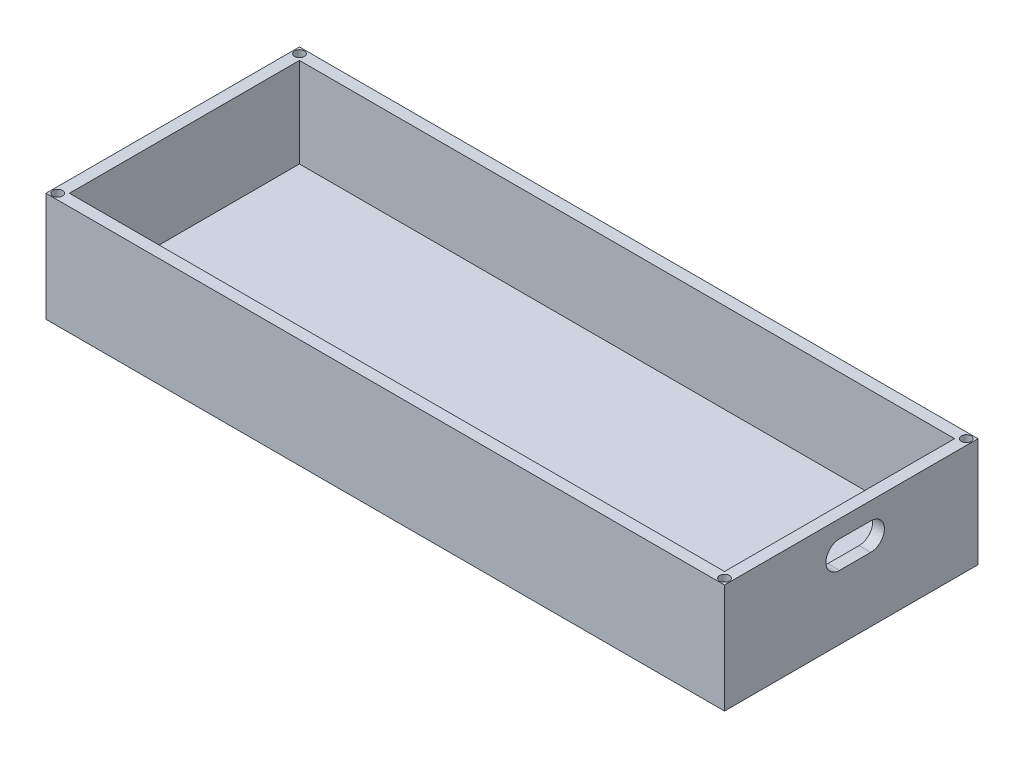
ISO-10303-21;
HEADER;
FILE_DESCRIPTION(('STEP AP214'),'2;1');
FILE_NAME('part.step','',(''),(''),'','','');
FILE_SCHEMA(('AUTOMOTIVE_DESIGN { 1 0 10303 214 1 1 1 1 }'));
ENDSEC;
DATA;
#1=APPLICATION_CONTEXT('core data for automotive mechanical design processes');
#2=APPLICATION_PROTOCOL_DEFINITION('international standard','automotive_design',2000,#1);
#3=PRODUCT_CONTEXT('',#1,'mechanical');
#4=PRODUCT('Part','Part','',(#3));
#5=PRODUCT_RELATED_PRODUCT_CATEGORY('part','',(#4));
#6=PRODUCT_DEFINITION_FORMATION('','',#4);
#7=PRODUCT_DEFINITION_CONTEXT('part definition',#1,'design');
#8=PRODUCT_DEFINITION('design','',#6,#7);
#9=PRODUCT_DEFINITION_SHAPE('','',#8);
#10=(LENGTH_UNIT() NAMED_UNIT(*) SI_UNIT(.MILLI.,.METRE.));
#11=(NAMED_UNIT(*) PLANE_ANGLE_UNIT() SI_UNIT($,.RADIAN.));
#12=(NAMED_UNIT(*) SI_UNIT($,.STERADIAN.) SOLID_ANGLE_UNIT());
#13=UNCERTAINTY_MEASURE_WITH_UNIT(LENGTH_MEASURE(1.E-05),#10,'distance_accuracy_value','');
#14=(GEOMETRIC_REPRESENTATION_CONTEXT(3) GLOBAL_UNCERTAINTY_ASSIGNED_CONTEXT((#13)) GLOBAL_UNIT_ASSIGNED_CONTEXT((#10,
#11,#12)) REPRESENTATION_CONTEXT('',''));
#15=CARTESIAN_POINT('',(0.,0.,0.));
#16=DIRECTION('',(0.,0.,1.));
#17=DIRECTION('',(1.,0.,0.));
#18=AXIS2_PLACEMENT_3D('',#15,#16,#17);
#19=CARTESIAN_POINT('',(87.,5.,32.5));
#20=DIRECTION('',(-1.,0.,0.));
#21=DIRECTION('',(0.,0.,1.));
#22=AXIS2_PLACEMENT_3D('',#19,#20,#21);
#23=PLANE('',#22);
#24=DIRECTION('',(0.,0.,-1.));
#25=VECTOR('',#24,1.);
#26=CARTESIAN_POINT('',(87.,16.5,3.00000000000001));
#27=LINE('',#26,#25);
#28=CARTESIAN_POINT('',(87.,16.5,3.00000000000001));
#29=VERTEX_POINT('',#28);
#30=CARTESIAN_POINT('',(87.,16.5,-4.99999999999999));
#31=VERTEX_POINT('',#30);
#32=EDGE_CURVE('E140',#29,#31,#27,.T.);
#33=ORIENTED_EDGE('',*,*,#32,.F.);
#34=CARTESIAN_POINT('',(87.,20.,3.00000000000001));
#35=DIRECTION('',(1.,0.,0.));
#36=DIRECTION('',(0.,0.,-1.));
#37=AXIS2_PLACEMENT_3D('',#34,#35,#36);
#38=CIRCLE('',#37,3.5);
#39=CARTESIAN_POINT('',(87.,23.5,3.00000000000001));
#40=VERTEX_POINT('',#39);
#41=EDGE_CURVE('E54',#40,#29,#38,.T.);
#42=ORIENTED_EDGE('',*,*,#41,.F.);
#43=DIRECTION('',(0.,0.,1.));
#44=VECTOR('',#43,1.);
#45=CARTESIAN_POINT('',(87.,23.5,3.00000000000001));
#46=LINE('',#45,#44);
#47=CARTESIAN_POINT('',(87.,23.5,-4.99999999999999));
#48=VERTEX_POINT('',#47);
#49=EDGE_CURVE('E147',#48,#40,#46,.T.);
#50=ORIENTED_EDGE('',*,*,#49,.F.);
#51=CARTESIAN_POINT('',(87.,20.,-4.99999999999999));
#52=DIRECTION('',(1.,0.,0.));
#53=DIRECTION('',(0.,0.,-1.));
#54=AXIS2_PLACEMENT_3D('',#51,#52,#53);
#55=CIRCLE('',#54,3.5);
#56=EDGE_CURVE('E130',#31,#48,#55,.T.);
#57=ORIENTED_EDGE('',*,*,#56,.F.);
#58=EDGE_LOOP('',(#33,#42,#50,#57));
#59=FACE_BOUND('',#58,.T.);
#60=DIRECTION('',(0.,0.,-1.));
#61=VECTOR('',#60,1.);
#62=CARTESIAN_POINT('',(87.,0.,32.5));
#63=LINE('',#62,#61);
#64=CARTESIAN_POINT('',(87.,0.,32.5));
#65=VERTEX_POINT('',#64);
#66=CARTESIAN_POINT('',(87.,0.,-32.5));
#67=VERTEX_POINT('',#66);
#68=EDGE_CURVE('E219',#65,#67,#63,.T.);
#69=ORIENTED_EDGE('',*,*,#68,.T.);
#70=DIRECTION('',(0.,-1.,0.));
#71=VECTOR('',#70,1.);
#72=CARTESIAN_POINT('',(87.,5.,-32.5));
#73=LINE('',#72,#71);
#74=CARTESIAN_POINT('',(87.,28.,-32.5));
#75=VERTEX_POINT('',#74);
#76=EDGE_CURVE('E244',#75,#67,#73,.T.);
#77=ORIENTED_EDGE('',*,*,#76,.F.);
#78=DIRECTION('',(0.,0.,-1.));
#79=VECTOR('',#78,1.);
#80=CARTESIAN_POINT('',(87.,28.,32.5));
#81=LINE('',#80,#79);
#82=CARTESIAN_POINT('',(87.,28.,32.5));
#83=VERTEX_POINT('',#82);
#84=EDGE_CURVE('E211',#83,#75,#81,.T.);
#85=ORIENTED_EDGE('',*,*,#84,.F.);
#86=DIRECTION('',(0.,-1.,0.));
#87=VECTOR('',#86,1.);
#88=CARTESIAN_POINT('',(87.,5.,32.5));
#89=LINE('',#88,#87);
#90=EDGE_CURVE('E232',#83,#65,#89,.T.);
#91=ORIENTED_EDGE('',*,*,#90,.T.);
#92=EDGE_LOOP('',(#69,#77,#85,#91));
#93=FACE_BOUND('',#92,.T.);
#94=ADVANCED_FACE('F39',(#59,#93),#23,.F.);
#95=CARTESIAN_POINT('',(-87.,5.,-32.5));
#96=DIRECTION('',(0.,0.,1.));
#97=DIRECTION('',(1.,0.,0.));
#98=AXIS2_PLACEMENT_3D('',#95,#96,#97);
#99=PLANE('',#98);
#100=DIRECTION('',(-1.,0.,0.));
#101=VECTOR('',#100,1.);
#102=CARTESIAN_POINT('',(-87.,0.,-32.5));
#103=LINE('',#102,#101);
#104=CARTESIAN_POINT('',(-87.,0.,-32.5));
#105=VERTEX_POINT('',#104);
#106=EDGE_CURVE('E223',#67,#105,#103,.T.);
#107=ORIENTED_EDGE('',*,*,#106,.T.);
#108=DIRECTION('',(0.,-1.,0.));
#109=VECTOR('',#108,1.);
#110=CARTESIAN_POINT('',(-87.,5.,-32.5));
#111=LINE('',#110,#109);
#112=CARTESIAN_POINT('',(-87.,28.,-32.5));
#113=VERTEX_POINT('',#112);
#114=EDGE_CURVE('E240',#113,#105,#111,.T.);
#115=ORIENTED_EDGE('',*,*,#114,.F.);
#116=DIRECTION('',(-1.,0.,0.));
#117=VECTOR('',#116,1.);
#118=CARTESIAN_POINT('',(-87.,28.,-32.5));
#119=LINE('',#118,#117);
#120=EDGE_CURVE('E215',#75,#113,#119,.T.);
#121=ORIENTED_EDGE('',*,*,#120,.F.);
#122=ORIENTED_EDGE('',*,*,#76,.T.);
#123=EDGE_LOOP('',(#107,#115,#121,#122));
#124=FACE_BOUND('',#123,.T.);
#125=ADVANCED_FACE('F343',(#124),#99,.F.);
#126=CARTESIAN_POINT('',(-87.,5.,32.5));
#127=DIRECTION('',(1.,0.,0.));
#128=DIRECTION('',(0.,0.,-1.));
#129=AXIS2_PLACEMENT_3D('',#126,#127,#128);
#130=PLANE('',#129);
#131=DIRECTION('',(0.,0.,1.));
#132=VECTOR('',#131,1.);
#133=CARTESIAN_POINT('',(-87.,0.,32.5));
#134=LINE('',#133,#132);
#135=CARTESIAN_POINT('',(-87.,0.,32.5));
#136=VERTEX_POINT('',#135);
#137=EDGE_CURVE('E226',#105,#136,#134,.T.);
#138=ORIENTED_EDGE('',*,*,#137,.T.);
#139=DIRECTION('',(0.,-1.,0.));
#140=VECTOR('',#139,1.);
#141=CARTESIAN_POINT('',(-87.,5.,32.5));
#142=LINE('',#141,#140);
#143=CARTESIAN_POINT('',(-87.,28.,32.5));
#144=VERTEX_POINT('',#143);
#145=EDGE_CURVE('E236',#144,#136,#142,.T.);
#146=ORIENTED_EDGE('',*,*,#145,.F.);
#147=DIRECTION('',(0.,0.,1.));
#148=VECTOR('',#147,1.);
#149=CARTESIAN_POINT('',(-87.,28.,32.5));
#150=LINE('',#149,#148);
#151=EDGE_CURVE('E203',#113,#144,#150,.T.);
#152=ORIENTED_EDGE('',*,*,#151,.F.);
#153=ORIENTED_EDGE('',*,*,#114,.T.);
#154=EDGE_LOOP('',(#138,#146,#152,#153));
#155=FACE_BOUND('',#154,.T.);
#156=ADVANCED_FACE('F347',(#155),#130,.F.);
#157=CARTESIAN_POINT('',(-87.,5.,32.5));
#158=DIRECTION('',(0.,0.,-1.));
#159=DIRECTION('',(-1.,0.,0.));
#160=AXIS2_PLACEMENT_3D('',#157,#158,#159);
#161=PLANE('',#160);
#162=DIRECTION('',(1.,0.,0.));
#163=VECTOR('',#162,1.);
#164=CARTESIAN_POINT('',(-87.,0.,32.5));
#165=LINE('',#164,#163);
#166=EDGE_CURVE('E229',#136,#65,#165,.T.);
#167=ORIENTED_EDGE('',*,*,#166,.T.);
#168=ORIENTED_EDGE('',*,*,#90,.F.);
#169=DIRECTION('',(1.,0.,0.));
#170=VECTOR('',#169,1.);
#171=CARTESIAN_POINT('',(-87.,28.,32.5));
#172=LINE('',#171,#170);
#173=EDGE_CURVE('E207',#144,#83,#172,.T.);
#174=ORIENTED_EDGE('',*,*,#173,.F.);
#175=ORIENTED_EDGE('',*,*,#145,.T.);
#176=EDGE_LOOP('',(#167,#168,#174,#175));
#177=FACE_BOUND('',#176,.T.);
#178=ADVANCED_FACE('F352',(#177),#161,.F.);
#179=CARTESIAN_POINT('',(0.,0.,0.));
#180=DIRECTION('',(0.,-1.,0.));
#181=DIRECTION('',(0.,0.,-1.));
#182=AXIS2_PLACEMENT_3D('',#179,#180,#181);
#183=PLANE('',#182);
#184=ORIENTED_EDGE('',*,*,#68,.F.);
#185=ORIENTED_EDGE('',*,*,#166,.F.);
#186=ORIENTED_EDGE('',*,*,#137,.F.);
#187=ORIENTED_EDGE('',*,*,#106,.F.);
#188=EDGE_LOOP('',(#184,#185,#186,#187));
#189=FACE_BOUND('',#188,.T.);
#190=ADVANCED_FACE('F310',(#189),#183,.T.);
#191=CARTESIAN_POINT('',(0.,28.,0.));
#192=DIRECTION('',(0.,-1.,0.));
#193=DIRECTION('',(0.,0.,-1.));
#194=AXIS2_PLACEMENT_3D('',#191,#192,#193);
#195=PLANE('',#194);
#196=CARTESIAN_POINT('',(-85.4999999999993,28.,31.));
#197=DIRECTION('',(0.,1.,0.));
#198=DIRECTION('',(0.,0.,1.));
#199=AXIS2_PLACEMENT_3D('',#196,#197,#198);
#200=CIRCLE('',#199,1.25);
#201=CARTESIAN_POINT('',(-85.4999999999993,28.,32.25));
#202=VERTEX_POINT('',#201);
#203=EDGE_CURVE('E273',#202,#202,#200,.T.);
#204=ORIENTED_EDGE('',*,*,#203,.F.);
#205=EDGE_LOOP('',(#204));
#206=FACE_BOUND('',#205,.T.);
#207=CARTESIAN_POINT('',(85.5000000000007,28.,31.));
#208=DIRECTION('',(0.,1.,0.));
#209=DIRECTION('',(0.,0.,1.));
#210=AXIS2_PLACEMENT_3D('',#207,#208,#209);
#211=CIRCLE('',#210,1.25);
#212=CARTESIAN_POINT('',(85.5000000000007,28.,32.25));
#213=VERTEX_POINT('',#212);
#214=EDGE_CURVE('E281',#213,#213,#211,.T.);
#215=ORIENTED_EDGE('',*,*,#214,.F.);
#216=EDGE_LOOP('',(#215));
#217=FACE_BOUND('',#216,.T.);
#218=CARTESIAN_POINT('',(85.5,28.,-31.));
#219=DIRECTION('',(0.,1.,0.));
#220=DIRECTION('',(0.,0.,1.));
#221=AXIS2_PLACEMENT_3D('',#218,#219,#220);
#222=CIRCLE('',#221,1.25);
#223=CARTESIAN_POINT('',(85.5,28.,-29.75));
#224=VERTEX_POINT('',#223);
#225=EDGE_CURVE('E289',#224,#224,#222,.T.);
#226=ORIENTED_EDGE('',*,*,#225,.F.);
#227=EDGE_LOOP('',(#226));
#228=FACE_BOUND('',#227,.T.);
#229=CARTESIAN_POINT('',(-85.5,28.,-31.));
#230=DIRECTION('',(0.,1.,0.));
#231=DIRECTION('',(0.,0.,1.));
#232=AXIS2_PLACEMENT_3D('',#229,#230,#231);
#233=CIRCLE('',#232,1.25);
#234=CARTESIAN_POINT('',(-85.5,28.,-29.75));
#235=VERTEX_POINT('',#234);
#236=EDGE_CURVE('E266',#235,#235,#233,.T.);
#237=ORIENTED_EDGE('',*,*,#236,.F.);
#238=EDGE_LOOP('',(#237));
#239=FACE_BOUND('',#238,.T.);
#240=ORIENTED_EDGE('',*,*,#151,.T.);
#241=ORIENTED_EDGE('',*,*,#173,.T.);
#242=ORIENTED_EDGE('',*,*,#84,.T.);
#243=ORIENTED_EDGE('',*,*,#120,.T.);
#244=EDGE_LOOP('',(#240,#241,#242,#243));
#245=FACE_BOUND('',#244,.T.);
#246=DIRECTION('',(1.,0.,0.));
#247=VECTOR('',#246,1.);
#248=CARTESIAN_POINT('',(-84.,28.,29.5));
#249=LINE('',#248,#247);
#250=CARTESIAN_POINT('',(-84.,28.,29.5));
#251=VERTEX_POINT('',#250);
#252=CARTESIAN_POINT('',(84.,28.,29.5));
#253=VERTEX_POINT('',#252);
#254=EDGE_CURVE('E162',#251,#253,#249,.T.);
#255=ORIENTED_EDGE('',*,*,#254,.F.);
#256=DIRECTION('',(0.,0.,1.));
#257=VECTOR('',#256,1.);
#258=CARTESIAN_POINT('',(-84.,28.,29.5));
#259=LINE('',#258,#257);
#260=CARTESIAN_POINT('',(-84.,28.,-29.5));
#261=VERTEX_POINT('',#260);
#262=EDGE_CURVE('E173',#261,#251,#259,.T.);
#263=ORIENTED_EDGE('',*,*,#262,.F.);
#264=DIRECTION('',(-1.,0.,0.));
#265=VECTOR('',#264,1.);
#266=CARTESIAN_POINT('',(-84.,28.,-29.5));
#267=LINE('',#266,#265);
#268=CARTESIAN_POINT('',(84.,28.,-29.5));
#269=VERTEX_POINT('',#268);
#270=EDGE_CURVE('E169',#269,#261,#267,.T.);
#271=ORIENTED_EDGE('',*,*,#270,.F.);
#272=DIRECTION('',(0.,0.,-1.));
#273=VECTOR('',#272,1.);
#274=CARTESIAN_POINT('',(84.,28.,29.5));
#275=LINE('',#274,#273);
#276=EDGE_CURVE('E165',#253,#269,#275,.T.);
#277=ORIENTED_EDGE('',*,*,#276,.F.);
#278=EDGE_LOOP('',(#255,#263,#271,#277));
#279=FACE_BOUND('',#278,.T.);
#280=ADVANCED_FACE('F306',(#206,#217,#228,#239,#245,#279),#195,.F.);
#281=CARTESIAN_POINT('',(-84.,28.,29.5));
#282=DIRECTION('',(0.,0.,-1.));
#283=DIRECTION('',(-1.,0.,0.));
#284=AXIS2_PLACEMENT_3D('',#281,#282,#283);
#285=PLANE('',#284);
#286=DIRECTION('',(1.,0.,0.));
#287=VECTOR('',#286,1.);
#288=CARTESIAN_POINT('',(-84.,5.,29.5));
#289=LINE('',#288,#287);
#290=CARTESIAN_POINT('',(-84.,5.,29.5));
#291=VERTEX_POINT('',#290);
#292=CARTESIAN_POINT('',(84.,5.,29.5));
#293=VERTEX_POINT('',#292);
#294=EDGE_CURVE('E157',#291,#293,#289,.T.);
#295=ORIENTED_EDGE('',*,*,#294,.F.);
#296=DIRECTION('',(0.,-1.,0.));
#297=VECTOR('',#296,1.);
#298=CARTESIAN_POINT('',(-84.,28.,29.5));
#299=LINE('',#298,#297);
#300=EDGE_CURVE('E176',#251,#291,#299,.T.);
#301=ORIENTED_EDGE('',*,*,#300,.F.);
#302=ORIENTED_EDGE('',*,*,#254,.T.);
#303=DIRECTION('',(0.,-1.,0.));
#304=VECTOR('',#303,1.);
#305=CARTESIAN_POINT('',(84.,28.,29.5));
#306=LINE('',#305,#304);
#307=EDGE_CURVE('E199',#253,#293,#306,.T.);
#308=ORIENTED_EDGE('',*,*,#307,.T.);
#309=EDGE_LOOP('',(#295,#301,#302,#308));
#310=FACE_BOUND('',#309,.T.);
#311=ADVANCED_FACE('F309',(#310),#285,.T.);
#312=CARTESIAN_POINT('',(84.,28.,29.5));
#313=DIRECTION('',(-1.,0.,0.));
#314=DIRECTION('',(0.,0.,1.));
#315=AXIS2_PLACEMENT_3D('',#312,#313,#314);
#316=PLANE('',#315);
#317=CARTESIAN_POINT('',(84.,20.,3.00000000000001));
#318=DIRECTION('',(-1.,0.,0.));
#319=DIRECTION('',(0.,0.,1.));
#320=AXIS2_PLACEMENT_3D('',#317,#318,#319);
#321=CIRCLE('',#320,3.5);
#322=CARTESIAN_POINT('',(84.,16.5,3.00000000000001));
#323=VERTEX_POINT('',#322);
#324=CARTESIAN_POINT('',(84.,23.5,3.00000000000001));
#325=VERTEX_POINT('',#324);
#326=EDGE_CURVE('E11',#323,#325,#321,.T.);
#327=ORIENTED_EDGE('',*,*,#326,.F.);
#328=DIRECTION('',(0.,0.,1.));
#329=VECTOR('',#328,1.);
#330=CARTESIAN_POINT('',(84.,16.5,29.5));
#331=LINE('',#330,#329);
#332=CARTESIAN_POINT('',(84.,16.5,-4.99999999999999));
#333=VERTEX_POINT('',#332);
#334=EDGE_CURVE('E248',#333,#323,#331,.T.);
#335=ORIENTED_EDGE('',*,*,#334,.F.);
#336=CARTESIAN_POINT('',(84.,20.,-4.99999999999999));
#337=DIRECTION('',(-1.,0.,0.));
#338=DIRECTION('',(0.,0.,1.));
#339=AXIS2_PLACEMENT_3D('',#336,#337,#338);
#340=CIRCLE('',#339,3.5);
#341=CARTESIAN_POINT('',(84.,23.5,-4.99999999999999));
#342=VERTEX_POINT('',#341);
#343=EDGE_CURVE('E133',#342,#333,#340,.T.);
#344=ORIENTED_EDGE('',*,*,#343,.F.);
#345=DIRECTION('',(0.,0.,-1.));
#346=VECTOR('',#345,1.);
#347=CARTESIAN_POINT('',(84.,23.5,29.5));
#348=LINE('',#347,#346);
#349=EDGE_CURVE('E47',#325,#342,#348,.T.);
#350=ORIENTED_EDGE('',*,*,#349,.F.);
#351=EDGE_LOOP('',(#327,#335,#344,#350));
#352=FACE_BOUND('',#351,.T.);
#353=DIRECTION('',(0.,0.,-1.));
#354=VECTOR('',#353,1.);
#355=CARTESIAN_POINT('',(84.,5.,29.5));
#356=LINE('',#355,#354);
#357=CARTESIAN_POINT('',(84.,5.,-29.5));
#358=VERTEX_POINT('',#357);
#359=EDGE_CURVE('E180',#293,#358,#356,.T.);
#360=ORIENTED_EDGE('',*,*,#359,.F.);
#361=ORIENTED_EDGE('',*,*,#307,.F.);
#362=ORIENTED_EDGE('',*,*,#276,.T.);
#363=DIRECTION('',(0.,-1.,0.));
#364=VECTOR('',#363,1.);
#365=CARTESIAN_POINT('',(84.,28.,-29.5));
#366=LINE('',#365,#364);
#367=EDGE_CURVE('E196',#269,#358,#366,.T.);
#368=ORIENTED_EDGE('',*,*,#367,.T.);
#369=EDGE_LOOP('',(#360,#361,#362,#368));
#370=FACE_BOUND('',#369,.T.);
#371=ADVANCED_FACE('F259',(#352,#370),#316,.T.);
#372=CARTESIAN_POINT('',(-84.,28.,-29.5));
#373=DIRECTION('',(0.,0.,1.));
#374=DIRECTION('',(1.,0.,0.));
#375=AXIS2_PLACEMENT_3D('',#372,#373,#374);
#376=PLANE('',#375);
#377=DIRECTION('',(-1.,0.,0.));
#378=VECTOR('',#377,1.);
#379=CARTESIAN_POINT('',(-84.,5.,-29.5));
#380=LINE('',#379,#378);
#381=CARTESIAN_POINT('',(-84.,5.,-29.5));
#382=VERTEX_POINT('',#381);
#383=EDGE_CURVE('E184',#358,#382,#380,.T.);
#384=ORIENTED_EDGE('',*,*,#383,.F.);
#385=ORIENTED_EDGE('',*,*,#367,.F.);
#386=ORIENTED_EDGE('',*,*,#270,.T.);
#387=DIRECTION('',(0.,-1.,0.));
#388=VECTOR('',#387,1.);
#389=CARTESIAN_POINT('',(-84.,28.,-29.5));
#390=LINE('',#389,#388);
#391=EDGE_CURVE('E193',#261,#382,#390,.T.);
#392=ORIENTED_EDGE('',*,*,#391,.T.);
#393=EDGE_LOOP('',(#384,#385,#386,#392));
#394=FACE_BOUND('',#393,.T.);
#395=ADVANCED_FACE('F333',(#394),#376,.T.);
#396=CARTESIAN_POINT('',(-84.,28.,29.5));
#397=DIRECTION('',(1.,0.,0.));
#398=DIRECTION('',(0.,0.,-1.));
#399=AXIS2_PLACEMENT_3D('',#396,#397,#398);
#400=PLANE('',#399);
#401=DIRECTION('',(0.,0.,1.));
#402=VECTOR('',#401,1.);
#403=CARTESIAN_POINT('',(-84.,5.,29.5));
#404=LINE('',#403,#402);
#405=EDGE_CURVE('E166',#382,#291,#404,.T.);
#406=ORIENTED_EDGE('',*,*,#405,.F.);
#407=ORIENTED_EDGE('',*,*,#391,.F.);
#408=ORIENTED_EDGE('',*,*,#262,.T.);
#409=ORIENTED_EDGE('',*,*,#300,.T.);
#410=EDGE_LOOP('',(#406,#407,#408,#409));
#411=FACE_BOUND('',#410,.T.);
#412=ADVANCED_FACE('F331',(#411),#400,.T.);
#413=CARTESIAN_POINT('',(0.,5.,0.));
#414=DIRECTION('',(0.,-1.,0.));
#415=DIRECTION('',(0.,0.,-1.));
#416=AXIS2_PLACEMENT_3D('',#413,#414,#415);
#417=PLANE('',#416);
#418=ORIENTED_EDGE('',*,*,#405,.T.);
#419=ORIENTED_EDGE('',*,*,#294,.T.);
#420=ORIENTED_EDGE('',*,*,#359,.T.);
#421=ORIENTED_EDGE('',*,*,#383,.T.);
#422=EDGE_LOOP('',(#418,#419,#420,#421));
#423=FACE_BOUND('',#422,.T.);
#424=ADVANCED_FACE('F328',(#423),#417,.F.);
#425=CARTESIAN_POINT('',(64.,20.,3.00000000000001));
#426=DIRECTION('',(1.,0.,0.));
#427=DIRECTION('',(0.,0.,-1.));
#428=AXIS2_PLACEMENT_3D('',#425,#426,#427);
#429=CYLINDRICAL_SURFACE('',#428,3.5);
#430=ORIENTED_EDGE('',*,*,#326,.T.);
#431=DIRECTION('',(1.,0.,0.));
#432=VECTOR('',#431,1.);
#433=CARTESIAN_POINT('',(64.,23.5,3.00000000000001));
#434=LINE('',#433,#432);
#435=EDGE_CURVE('E154',#325,#40,#434,.T.);
#436=ORIENTED_EDGE('',*,*,#435,.T.);
#437=ORIENTED_EDGE('',*,*,#41,.T.);
#438=DIRECTION('',(1.,0.,0.));
#439=VECTOR('',#438,1.);
#440=CARTESIAN_POINT('',(64.,16.5,3.00000000000001));
#441=LINE('',#440,#439);
#442=EDGE_CURVE('E137',#323,#29,#441,.T.);
#443=ORIENTED_EDGE('',*,*,#442,.F.);
#444=EDGE_LOOP('',(#430,#436,#437,#443));
#445=FACE_BOUND('',#444,.T.);
#446=ADVANCED_FACE('F261',(#445),#429,.F.);
#447=CARTESIAN_POINT('',(64.,23.5,3.00000000000001));
#448=DIRECTION('',(0.,1.,0.));
#449=DIRECTION('',(0.,0.,1.));
#450=AXIS2_PLACEMENT_3D('',#447,#448,#449);
#451=PLANE('',#450);
#452=ORIENTED_EDGE('',*,*,#349,.T.);
#453=DIRECTION('',(1.,0.,0.));
#454=VECTOR('',#453,1.);
#455=CARTESIAN_POINT('',(64.,23.5,-4.99999999999999));
#456=LINE('',#455,#454);
#457=EDGE_CURVE('E136',#342,#48,#456,.T.);
#458=ORIENTED_EDGE('',*,*,#457,.T.);
#459=ORIENTED_EDGE('',*,*,#49,.T.);
#460=ORIENTED_EDGE('',*,*,#435,.F.);
#461=EDGE_LOOP('',(#452,#458,#459,#460));
#462=FACE_BOUND('',#461,.T.);
#463=ADVANCED_FACE('F256',(#462),#451,.F.);
#464=CARTESIAN_POINT('',(64.,20.,-4.99999999999999));
#465=DIRECTION('',(1.,0.,0.));
#466=DIRECTION('',(0.,0.,-1.));
#467=AXIS2_PLACEMENT_3D('',#464,#465,#466);
#468=CYLINDRICAL_SURFACE('',#467,3.5);
#469=ORIENTED_EDGE('',*,*,#343,.T.);
#470=DIRECTION('',(1.,0.,0.));
#471=VECTOR('',#470,1.);
#472=CARTESIAN_POINT('',(64.,16.5,-4.99999999999999));
#473=LINE('',#472,#471);
#474=EDGE_CURVE('E62',#333,#31,#473,.T.);
#475=ORIENTED_EDGE('',*,*,#474,.T.);
#476=ORIENTED_EDGE('',*,*,#56,.T.);
#477=ORIENTED_EDGE('',*,*,#457,.F.);
#478=EDGE_LOOP('',(#469,#475,#476,#477));
#479=FACE_BOUND('',#478,.T.);
#480=ADVANCED_FACE('F127',(#479),#468,.F.);
#481=CARTESIAN_POINT('',(64.,16.5,3.00000000000001));
#482=DIRECTION('',(0.,-1.,0.));
#483=DIRECTION('',(0.,0.,-1.));
#484=AXIS2_PLACEMENT_3D('',#481,#482,#483);
#485=PLANE('',#484);
#486=ORIENTED_EDGE('',*,*,#334,.T.);
#487=ORIENTED_EDGE('',*,*,#442,.T.);
#488=ORIENTED_EDGE('',*,*,#32,.T.);
#489=ORIENTED_EDGE('',*,*,#474,.F.);
#490=EDGE_LOOP('',(#486,#487,#488,#489));
#491=FACE_BOUND('',#490,.T.);
#492=ADVANCED_FACE('F141',(#491),#485,.F.);
#493=CARTESIAN_POINT('',(-85.5,23.,-31.));
#494=DIRECTION('',(0.,1.,0.));
#495=DIRECTION('',(0.,0.,1.));
#496=AXIS2_PLACEMENT_3D('',#493,#494,#495);
#497=CYLINDRICAL_SURFACE('',#496,1.25);
#498=CARTESIAN_POINT('',(-85.5,23.,-31.));
#499=DIRECTION('',(0.,1.,0.));
#500=DIRECTION('',(0.,0.,1.));
#501=AXIS2_PLACEMENT_3D('',#498,#499,#500);
#502=CIRCLE('',#501,1.25);
#503=CARTESIAN_POINT('',(-85.5,23.,-29.75));
#504=VERTEX_POINT('',#503);
#505=EDGE_CURVE('E263',#504,#504,#502,.T.);
#506=ORIENTED_EDGE('',*,*,#505,.F.);
#507=EDGE_LOOP('',(#506));
#508=FACE_BOUND('',#507,.T.);
#509=ORIENTED_EDGE('',*,*,#236,.T.);
#510=EDGE_LOOP('',(#509));
#511=FACE_BOUND('',#510,.T.);
#512=ADVANCED_FACE('F411',(#508,#511),#497,.F.);
#513=CARTESIAN_POINT('',(-85.5,23.,-31.));
#514=DIRECTION('',(0.,1.,0.));
#515=DIRECTION('',(0.,0.,1.));
#516=AXIS2_PLACEMENT_3D('',#513,#514,#515);
#517=PLANE('',#516);
#518=ORIENTED_EDGE('',*,*,#505,.T.);
#519=EDGE_LOOP('',(#518));
#520=FACE_BOUND('',#519,.T.);
#521=ADVANCED_FACE('F302',(#520),#517,.T.);
#522=CARTESIAN_POINT('',(85.5,23.,-31.));
#523=DIRECTION('',(0.,1.,0.));
#524=DIRECTION('',(0.,0.,1.));
#525=AXIS2_PLACEMENT_3D('',#522,#523,#524);
#526=CYLINDRICAL_SURFACE('',#525,1.25);
#527=CARTESIAN_POINT('',(85.5,23.,-31.));
#528=DIRECTION('',(0.,1.,0.));
#529=DIRECTION('',(0.,0.,1.));
#530=AXIS2_PLACEMENT_3D('',#527,#528,#529);
#531=CIRCLE('',#530,1.25);
#532=CARTESIAN_POINT('',(85.5,23.,-29.75));
#533=VERTEX_POINT('',#532);
#534=EDGE_CURVE('E271',#533,#533,#531,.T.);
#535=ORIENTED_EDGE('',*,*,#534,.F.);
#536=EDGE_LOOP('',(#535));
#537=FACE_BOUND('',#536,.T.);
#538=ORIENTED_EDGE('',*,*,#225,.T.);
#539=EDGE_LOOP('',(#538));
#540=FACE_BOUND('',#539,.T.);
#541=ADVANCED_FACE('F299',(#537,#540),#526,.F.);
#542=CARTESIAN_POINT('',(85.5,23.,-31.));
#543=DIRECTION('',(0.,1.,0.));
#544=DIRECTION('',(0.,0.,1.));
#545=AXIS2_PLACEMENT_3D('',#542,#543,#544);
#546=PLANE('',#545);
#547=ORIENTED_EDGE('',*,*,#534,.T.);
#548=EDGE_LOOP('',(#547));
#549=FACE_BOUND('',#548,.T.);
#550=ADVANCED_FACE('F297',(#549),#546,.T.);
#551=CARTESIAN_POINT('',(85.5000000000007,23.,31.));
#552=DIRECTION('',(0.,1.,0.));
#553=DIRECTION('',(0.,0.,1.));
#554=AXIS2_PLACEMENT_3D('',#551,#552,#553);
#555=CYLINDRICAL_SURFACE('',#554,1.25);
#556=CARTESIAN_POINT('',(85.5000000000007,23.,31.));
#557=DIRECTION('',(0.,1.,0.));
#558=DIRECTION('',(0.,0.,1.));
#559=AXIS2_PLACEMENT_3D('',#556,#557,#558);
#560=CIRCLE('',#559,1.25);
#561=CARTESIAN_POINT('',(85.5000000000007,23.,32.25));
#562=VERTEX_POINT('',#561);
#563=EDGE_CURVE('E285',#562,#562,#560,.T.);
#564=ORIENTED_EDGE('',*,*,#563,.F.);
#565=EDGE_LOOP('',(#564));
#566=FACE_BOUND('',#565,.T.);
#567=ORIENTED_EDGE('',*,*,#214,.T.);
#568=EDGE_LOOP('',(#567));
#569=FACE_BOUND('',#568,.T.);
#570=ADVANCED_FACE('F450',(#566,#569),#555,.F.);
#571=CARTESIAN_POINT('',(85.5000000000007,23.,31.));
#572=DIRECTION('',(0.,1.,0.));
#573=DIRECTION('',(0.,0.,1.));
#574=AXIS2_PLACEMENT_3D('',#571,#572,#573);
#575=PLANE('',#574);
#576=ORIENTED_EDGE('',*,*,#563,.T.);
#577=EDGE_LOOP('',(#576));
#578=FACE_BOUND('',#577,.T.);
#579=ADVANCED_FACE('F459',(#578),#575,.T.);
#580=CARTESIAN_POINT('',(-85.4999999999993,23.,31.));
#581=DIRECTION('',(0.,1.,0.));
#582=DIRECTION('',(0.,0.,1.));
#583=AXIS2_PLACEMENT_3D('',#580,#581,#582);
#584=CYLINDRICAL_SURFACE('',#583,1.25);
#585=CARTESIAN_POINT('',(-85.4999999999993,23.,31.));
#586=DIRECTION('',(0.,1.,0.));
#587=DIRECTION('',(0.,0.,1.));
#588=AXIS2_PLACEMENT_3D('',#585,#586,#587);
#589=CIRCLE('',#588,1.25);
#590=CARTESIAN_POINT('',(-85.4999999999993,23.,32.25));
#591=VERTEX_POINT('',#590);
#592=EDGE_CURVE('E277',#591,#591,#589,.T.);
#593=ORIENTED_EDGE('',*,*,#592,.F.);
#594=EDGE_LOOP('',(#593));
#595=FACE_BOUND('',#594,.T.);
#596=ORIENTED_EDGE('',*,*,#203,.T.);
#597=EDGE_LOOP('',(#596));
#598=FACE_BOUND('',#597,.T.);
#599=ADVANCED_FACE('F469',(#595,#598),#584,.F.);
#600=CARTESIAN_POINT('',(-85.4999999999993,23.,31.));
#601=DIRECTION('',(0.,1.,0.));
#602=DIRECTION('',(0.,0.,1.));
#603=AXIS2_PLACEMENT_3D('',#600,#601,#602);
#604=PLANE('',#603);
#605=ORIENTED_EDGE('',*,*,#592,.T.);
#606=EDGE_LOOP('',(#605));
#607=FACE_BOUND('',#606,.T.);
#608=ADVANCED_FACE('F479',(#607),#604,.T.);
#609=CLOSED_SHELL('',(#94,#125,#156,#178,#190,#280,#311,#371,#395,#412,#424,#446,#463,#480,#492,
#512,#521,#541,#550,#570,#579,#599,#608));
#610=MANIFOLD_SOLID_BREP('B2',#609);
#611=ADVANCED_BREP_SHAPE_REPRESENTATION('',(#18,#610),#14);
#612=SHAPE_DEFINITION_REPRESENTATION(#9,#611);
ENDSEC;
END-ISO-10303-21;
